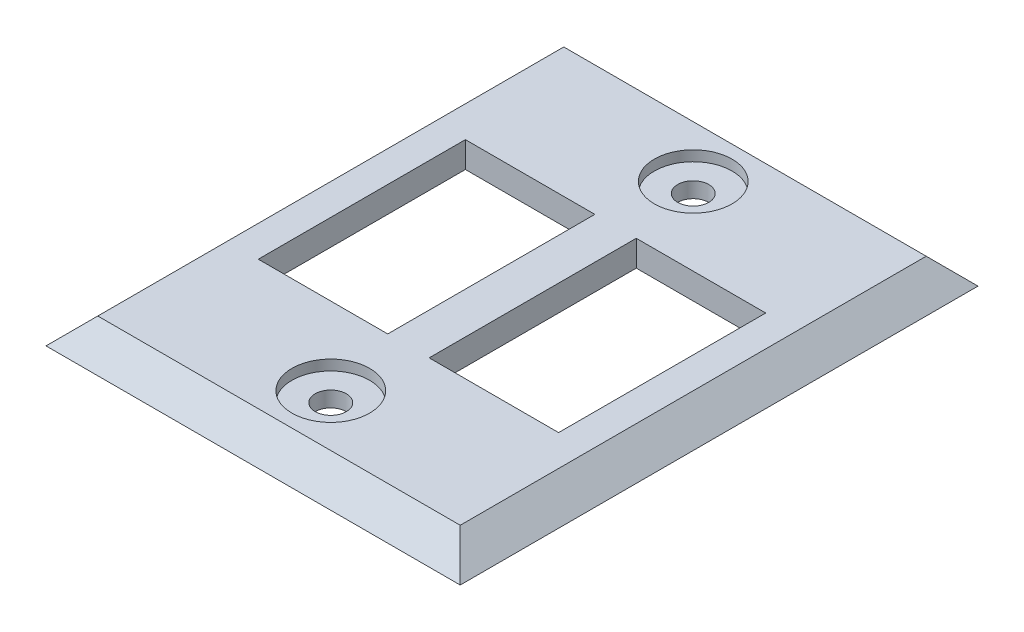
ISO-10303-21;
HEADER;
FILE_DESCRIPTION(('STEP AP214'),'2;1');
FILE_NAME('part.step','',(''),(''),'','','');
FILE_SCHEMA(('AUTOMOTIVE_DESIGN { 1 0 10303 214 1 1 1 1 }'));
ENDSEC;
DATA;
#1=APPLICATION_CONTEXT('core data for automotive mechanical design processes');
#2=APPLICATION_PROTOCOL_DEFINITION('international standard','automotive_design',2000,#1);
#3=PRODUCT_CONTEXT('',#1,'mechanical');
#4=PRODUCT('Part','Part','',(#3));
#5=PRODUCT_RELATED_PRODUCT_CATEGORY('part','',(#4));
#6=PRODUCT_DEFINITION_FORMATION('','',#4);
#7=PRODUCT_DEFINITION_CONTEXT('part definition',#1,'design');
#8=PRODUCT_DEFINITION('design','',#6,#7);
#9=PRODUCT_DEFINITION_SHAPE('','',#8);
#10=(LENGTH_UNIT() NAMED_UNIT(*) SI_UNIT(.MILLI.,.METRE.));
#11=(NAMED_UNIT(*) PLANE_ANGLE_UNIT() SI_UNIT($,.RADIAN.));
#12=(NAMED_UNIT(*) SI_UNIT($,.STERADIAN.) SOLID_ANGLE_UNIT());
#13=UNCERTAINTY_MEASURE_WITH_UNIT(LENGTH_MEASURE(1.E-05),#10,'distance_accuracy_value','');
#14=(GEOMETRIC_REPRESENTATION_CONTEXT(3) GLOBAL_UNCERTAINTY_ASSIGNED_CONTEXT((#13)) GLOBAL_UNIT_ASSIGNED_CONTEXT((#10,
#11,#12)) REPRESENTATION_CONTEXT('',''));
#15=CARTESIAN_POINT('',(0.,0.,0.));
#16=DIRECTION('',(0.,0.,1.));
#17=DIRECTION('',(1.,0.,0.));
#18=AXIS2_PLACEMENT_3D('',#15,#16,#17);
#19=CARTESIAN_POINT('',(0.,-7.5,17.5));
#20=DIRECTION('',(0.,1.,0.));
#21=DIRECTION('',(0.,0.,1.));
#22=AXIS2_PLACEMENT_3D('',#19,#20,#21);
#23=CYLINDRICAL_SURFACE('',#22,1.5);
#24=CARTESIAN_POINT('',(0.,0.,17.5));
#25=DIRECTION('',(0.,1.,0.));
#26=DIRECTION('',(0.,0.,1.));
#27=AXIS2_PLACEMENT_3D('',#24,#25,#26);
#28=CIRCLE('',#27,1.5);
#29=CARTESIAN_POINT('',(0.,0.,19.));
#30=VERTEX_POINT('',#29);
#31=EDGE_CURVE('E216',#30,#30,#28,.T.);
#32=ORIENTED_EDGE('',*,*,#31,.F.);
#33=EDGE_LOOP('',(#32));
#34=FACE_BOUND('',#33,.T.);
#35=CARTESIAN_POINT('',(0.,1.5,17.5));
#36=DIRECTION('',(0.,1.,0.));
#37=DIRECTION('',(0.,0.,1.));
#38=AXIS2_PLACEMENT_3D('',#35,#36,#37);
#39=CIRCLE('',#38,1.5);
#40=CARTESIAN_POINT('',(0.,1.5,19.));
#41=VERTEX_POINT('',#40);
#42=EDGE_CURVE('E223',#41,#41,#39,.F.);
#43=ORIENTED_EDGE('',*,*,#42,.F.);
#44=EDGE_LOOP('',(#43));
#45=FACE_BOUND('',#44,.T.);
#46=ADVANCED_FACE('F35',(#34,#45),#23,.F.);
#47=CARTESIAN_POINT('',(0.,-7.5,-17.5));
#48=DIRECTION('',(0.,1.,0.));
#49=DIRECTION('',(0.,0.,1.));
#50=AXIS2_PLACEMENT_3D('',#47,#48,#49);
#51=CYLINDRICAL_SURFACE('',#50,1.5);
#52=CARTESIAN_POINT('',(0.,0.,-17.5));
#53=DIRECTION('',(0.,1.,0.));
#54=DIRECTION('',(0.,0.,1.));
#55=AXIS2_PLACEMENT_3D('',#52,#53,#54);
#56=CIRCLE('',#55,1.5);
#57=CARTESIAN_POINT('',(0.,0.,-16.));
#58=VERTEX_POINT('',#57);
#59=EDGE_CURVE('E161',#58,#58,#56,.T.);
#60=ORIENTED_EDGE('',*,*,#59,.F.);
#61=EDGE_LOOP('',(#60));
#62=FACE_BOUND('',#61,.T.);
#63=CARTESIAN_POINT('',(0.,1.5,-17.5));
#64=DIRECTION('',(0.,1.,0.));
#65=DIRECTION('',(0.,0.,1.));
#66=AXIS2_PLACEMENT_3D('',#63,#64,#65);
#67=CIRCLE('',#66,1.5);
#68=CARTESIAN_POINT('',(0.,1.5,-16.));
#69=VERTEX_POINT('',#68);
#70=EDGE_CURVE('E219',#69,#69,#67,.F.);
#71=ORIENTED_EDGE('',*,*,#70,.F.);
#72=EDGE_LOOP('',(#71));
#73=FACE_BOUND('',#72,.T.);
#74=ADVANCED_FACE('F258',(#62,#73),#51,.F.);
#75=CARTESIAN_POINT('',(0.,2.5,0.));
#76=DIRECTION('',(0.,1.,0.));
#77=DIRECTION('',(0.,0.,1.));
#78=AXIS2_PLACEMENT_3D('',#75,#76,#77);
#79=PLANE('',#78);
#80=DIRECTION('',(1.,0.,0.));
#81=VECTOR('',#80,1.);
#82=CARTESIAN_POINT('',(20.,2.5,22.5));
#83=LINE('',#82,#81);
#84=CARTESIAN_POINT('',(-17.5,2.5,22.5));
#85=VERTEX_POINT('',#84);
#86=CARTESIAN_POINT('',(17.5,2.5,22.5));
#87=VERTEX_POINT('',#86);
#88=EDGE_CURVE('E44',#85,#87,#83,.T.);
#89=ORIENTED_EDGE('',*,*,#88,.T.);
#90=DIRECTION('',(0.,0.,-1.));
#91=VECTOR('',#90,1.);
#92=CARTESIAN_POINT('',(17.5,2.5,-25.));
#93=LINE('',#92,#91);
#94=CARTESIAN_POINT('',(17.5,2.5,-22.5));
#95=VERTEX_POINT('',#94);
#96=EDGE_CURVE('E11',#87,#95,#93,.T.);
#97=ORIENTED_EDGE('',*,*,#96,.T.);
#98=DIRECTION('',(-1.,0.,0.));
#99=VECTOR('',#98,1.);
#100=CARTESIAN_POINT('',(-20.,2.5,-22.5));
#101=LINE('',#100,#99);
#102=CARTESIAN_POINT('',(-17.5,2.5,-22.5));
#103=VERTEX_POINT('',#102);
#104=EDGE_CURVE('E229',#95,#103,#101,.T.);
#105=ORIENTED_EDGE('',*,*,#104,.T.);
#106=DIRECTION('',(0.,0.,1.));
#107=VECTOR('',#106,1.);
#108=CARTESIAN_POINT('',(-17.5,2.5,25.));
#109=LINE('',#108,#107);
#110=EDGE_CURVE('E213',#103,#85,#109,.T.);
#111=ORIENTED_EDGE('',*,*,#110,.T.);
#112=EDGE_LOOP('',(#89,#97,#105,#111));
#113=FACE_BOUND('',#112,.T.);
#114=CARTESIAN_POINT('',(0.,2.5,17.5));
#115=DIRECTION('',(0.,1.,0.));
#116=DIRECTION('',(0.,0.,1.));
#117=AXIS2_PLACEMENT_3D('',#114,#115,#116);
#118=CIRCLE('',#117,3.75);
#119=CARTESIAN_POINT('',(0.,2.5,21.25));
#120=VERTEX_POINT('',#119);
#121=EDGE_CURVE('E239',#120,#120,#118,.T.);
#122=ORIENTED_EDGE('',*,*,#121,.F.);
#123=EDGE_LOOP('',(#122));
#124=FACE_BOUND('',#123,.T.);
#125=CARTESIAN_POINT('',(0.,2.5,-17.5));
#126=DIRECTION('',(0.,1.,0.));
#127=DIRECTION('',(0.,0.,1.));
#128=AXIS2_PLACEMENT_3D('',#125,#126,#127);
#129=CIRCLE('',#128,3.75);
#130=CARTESIAN_POINT('',(0.,2.5,-13.75));
#131=VERTEX_POINT('',#130);
#132=EDGE_CURVE('E226',#131,#131,#129,.T.);
#133=ORIENTED_EDGE('',*,*,#132,.F.);
#134=EDGE_LOOP('',(#133));
#135=FACE_BOUND('',#134,.T.);
#136=DIRECTION('',(1.,0.,0.));
#137=VECTOR('',#136,1.);
#138=CARTESIAN_POINT('',(-14.5,2.5,10.));
#139=LINE('',#138,#137);
#140=CARTESIAN_POINT('',(-14.5,2.5,10.));
#141=VERTEX_POINT('',#140);
#142=CARTESIAN_POINT('',(-2.,2.5,10.));
#143=VERTEX_POINT('',#142);
#144=EDGE_CURVE('E174',#141,#143,#139,.T.);
#145=ORIENTED_EDGE('',*,*,#144,.F.);
#146=DIRECTION('',(0.,0.,1.));
#147=VECTOR('',#146,1.);
#148=CARTESIAN_POINT('',(-14.5,2.5,-10.));
#149=LINE('',#148,#147);
#150=CARTESIAN_POINT('',(-14.5,2.5,-10.));
#151=VERTEX_POINT('',#150);
#152=EDGE_CURVE('E172',#151,#141,#149,.T.);
#153=ORIENTED_EDGE('',*,*,#152,.F.);
#154=DIRECTION('',(-1.,0.,0.));
#155=VECTOR('',#154,1.);
#156=CARTESIAN_POINT('',(-14.5,2.5,-10.));
#157=LINE('',#156,#155);
#158=CARTESIAN_POINT('',(-2.,2.5,-10.));
#159=VERTEX_POINT('',#158);
#160=EDGE_CURVE('E180',#159,#151,#157,.T.);
#161=ORIENTED_EDGE('',*,*,#160,.F.);
#162=DIRECTION('',(0.,0.,-1.));
#163=VECTOR('',#162,1.);
#164=CARTESIAN_POINT('',(-2.,2.5,-10.));
#165=LINE('',#164,#163);
#166=EDGE_CURVE('E177',#143,#159,#165,.T.);
#167=ORIENTED_EDGE('',*,*,#166,.F.);
#168=EDGE_LOOP('',(#145,#153,#161,#167));
#169=FACE_BOUND('',#168,.T.);
#170=DIRECTION('',(0.,0.,1.));
#171=VECTOR('',#170,1.);
#172=CARTESIAN_POINT('',(2.,2.5,-10.));
#173=LINE('',#172,#171);
#174=CARTESIAN_POINT('',(2.,2.5,-10.));
#175=VERTEX_POINT('',#174);
#176=CARTESIAN_POINT('',(2.,2.5,10.));
#177=VERTEX_POINT('',#176);
#178=EDGE_CURVE('E138',#175,#177,#173,.T.);
#179=ORIENTED_EDGE('',*,*,#178,.F.);
#180=DIRECTION('',(-1.,0.,0.));
#181=VECTOR('',#180,1.);
#182=CARTESIAN_POINT('',(14.5,2.5,-10.));
#183=LINE('',#182,#181);
#184=CARTESIAN_POINT('',(14.5,2.5,-10.));
#185=VERTEX_POINT('',#184);
#186=EDGE_CURVE('E128',#185,#175,#183,.T.);
#187=ORIENTED_EDGE('',*,*,#186,.F.);
#188=DIRECTION('',(0.,0.,-1.));
#189=VECTOR('',#188,1.);
#190=CARTESIAN_POINT('',(14.5,2.5,-10.));
#191=LINE('',#190,#189);
#192=CARTESIAN_POINT('',(14.5,2.5,10.));
#193=VERTEX_POINT('',#192);
#194=EDGE_CURVE('E154',#193,#185,#191,.T.);
#195=ORIENTED_EDGE('',*,*,#194,.F.);
#196=DIRECTION('',(1.,0.,0.));
#197=VECTOR('',#196,1.);
#198=CARTESIAN_POINT('',(14.5,2.5,10.));
#199=LINE('',#198,#197);
#200=EDGE_CURVE('E152',#177,#193,#199,.T.);
#201=ORIENTED_EDGE('',*,*,#200,.F.);
#202=EDGE_LOOP('',(#179,#187,#195,#201));
#203=FACE_BOUND('',#202,.T.);
#204=ADVANCED_FACE('F150',(#113,#124,#135,#169,#203),#79,.T.);
#205=CARTESIAN_POINT('',(0.,0.,0.));
#206=DIRECTION('',(0.,1.,0.));
#207=DIRECTION('',(0.,0.,1.));
#208=AXIS2_PLACEMENT_3D('',#205,#206,#207);
#209=PLANE('',#208);
#210=ORIENTED_EDGE('',*,*,#31,.T.);
#211=EDGE_LOOP('',(#210));
#212=FACE_BOUND('',#211,.T.);
#213=ORIENTED_EDGE('',*,*,#59,.T.);
#214=EDGE_LOOP('',(#213));
#215=FACE_BOUND('',#214,.T.);
#216=DIRECTION('',(0.,0.,1.));
#217=VECTOR('',#216,1.);
#218=CARTESIAN_POINT('',(-14.5,0.,-10.));
#219=LINE('',#218,#217);
#220=CARTESIAN_POINT('',(-14.5,0.,-10.));
#221=VERTEX_POINT('',#220);
#222=CARTESIAN_POINT('',(-14.5,0.,10.));
#223=VERTEX_POINT('',#222);
#224=EDGE_CURVE('E146',#221,#223,#219,.T.);
#225=ORIENTED_EDGE('',*,*,#224,.T.);
#226=DIRECTION('',(1.,0.,0.));
#227=VECTOR('',#226,1.);
#228=CARTESIAN_POINT('',(-14.5,0.,10.));
#229=LINE('',#228,#227);
#230=CARTESIAN_POINT('',(-2.,0.,10.));
#231=VERTEX_POINT('',#230);
#232=EDGE_CURVE('E185',#223,#231,#229,.T.);
#233=ORIENTED_EDGE('',*,*,#232,.T.);
#234=DIRECTION('',(0.,0.,-1.));
#235=VECTOR('',#234,1.);
#236=CARTESIAN_POINT('',(-2.,0.,-10.));
#237=LINE('',#236,#235);
#238=CARTESIAN_POINT('',(-2.,0.,-10.));
#239=VERTEX_POINT('',#238);
#240=EDGE_CURVE('E188',#231,#239,#237,.T.);
#241=ORIENTED_EDGE('',*,*,#240,.T.);
#242=DIRECTION('',(-1.,0.,0.));
#243=VECTOR('',#242,1.);
#244=CARTESIAN_POINT('',(-14.5,0.,-10.));
#245=LINE('',#244,#243);
#246=EDGE_CURVE('E175',#239,#221,#245,.T.);
#247=ORIENTED_EDGE('',*,*,#246,.T.);
#248=EDGE_LOOP('',(#225,#233,#241,#247));
#249=FACE_BOUND('',#248,.T.);
#250=DIRECTION('',(0.,0.,1.));
#251=VECTOR('',#250,1.);
#252=CARTESIAN_POINT('',(-20.,0.,-25.));
#253=LINE('',#252,#251);
#254=CARTESIAN_POINT('',(-20.,0.,-25.));
#255=VERTEX_POINT('',#254);
#256=CARTESIAN_POINT('',(-20.,0.,25.));
#257=VERTEX_POINT('',#256);
#258=EDGE_CURVE('E202',#255,#257,#253,.T.);
#259=ORIENTED_EDGE('',*,*,#258,.F.);
#260=DIRECTION('',(-1.,0.,0.));
#261=VECTOR('',#260,1.);
#262=CARTESIAN_POINT('',(-20.,0.,-25.));
#263=LINE('',#262,#261);
#264=CARTESIAN_POINT('',(20.,0.,-25.));
#265=VERTEX_POINT('',#264);
#266=EDGE_CURVE('E210',#265,#255,#263,.T.);
#267=ORIENTED_EDGE('',*,*,#266,.F.);
#268=DIRECTION('',(0.,0.,-1.));
#269=VECTOR('',#268,1.);
#270=CARTESIAN_POINT('',(20.,0.,-25.));
#271=LINE('',#270,#269);
#272=CARTESIAN_POINT('',(20.,0.,25.));
#273=VERTEX_POINT('',#272);
#274=EDGE_CURVE('E208',#273,#265,#271,.T.);
#275=ORIENTED_EDGE('',*,*,#274,.F.);
#276=DIRECTION('',(1.,0.,0.));
#277=VECTOR('',#276,1.);
#278=CARTESIAN_POINT('',(-20.,0.,25.));
#279=LINE('',#278,#277);
#280=EDGE_CURVE('E205',#257,#273,#279,.T.);
#281=ORIENTED_EDGE('',*,*,#280,.F.);
#282=EDGE_LOOP('',(#259,#267,#275,#281));
#283=FACE_BOUND('',#282,.T.);
#284=DIRECTION('',(-1.,0.,0.));
#285=VECTOR('',#284,1.);
#286=CARTESIAN_POINT('',(14.5,0.,-10.));
#287=LINE('',#286,#285);
#288=CARTESIAN_POINT('',(14.5,0.,-10.));
#289=VERTEX_POINT('',#288);
#290=CARTESIAN_POINT('',(2.,0.,-10.));
#291=VERTEX_POINT('',#290);
#292=EDGE_CURVE('E159',#289,#291,#287,.T.);
#293=ORIENTED_EDGE('',*,*,#292,.T.);
#294=DIRECTION('',(0.,0.,1.));
#295=VECTOR('',#294,1.);
#296=CARTESIAN_POINT('',(2.,0.,-10.));
#297=LINE('',#296,#295);
#298=CARTESIAN_POINT('',(2.,0.,10.));
#299=VERTEX_POINT('',#298);
#300=EDGE_CURVE('E145',#291,#299,#297,.T.);
#301=ORIENTED_EDGE('',*,*,#300,.T.);
#302=DIRECTION('',(1.,0.,0.));
#303=VECTOR('',#302,1.);
#304=CARTESIAN_POINT('',(14.5,0.,10.));
#305=LINE('',#304,#303);
#306=CARTESIAN_POINT('',(14.5,0.,10.));
#307=VERTEX_POINT('',#306);
#308=EDGE_CURVE('E163',#299,#307,#305,.T.);
#309=ORIENTED_EDGE('',*,*,#308,.T.);
#310=DIRECTION('',(0.,0.,-1.));
#311=VECTOR('',#310,1.);
#312=CARTESIAN_POINT('',(14.5,0.,-10.));
#313=LINE('',#312,#311);
#314=EDGE_CURVE('E139',#307,#289,#313,.T.);
#315=ORIENTED_EDGE('',*,*,#314,.T.);
#316=EDGE_LOOP('',(#293,#301,#309,#315));
#317=FACE_BOUND('',#316,.T.);
#318=ADVANCED_FACE('F257',(#212,#215,#249,#283,#317),#209,.F.);
#319=CARTESIAN_POINT('',(-14.5,2.5,-10.));
#320=DIRECTION('',(1.,0.,0.));
#321=DIRECTION('',(0.,0.,-1.));
#322=AXIS2_PLACEMENT_3D('',#319,#320,#321);
#323=PLANE('',#322);
#324=ORIENTED_EDGE('',*,*,#224,.F.);
#325=DIRECTION('',(0.,-1.,0.));
#326=VECTOR('',#325,1.);
#327=CARTESIAN_POINT('',(-14.5,2.5,-10.));
#328=LINE('',#327,#326);
#329=EDGE_CURVE('E182',#151,#221,#328,.T.);
#330=ORIENTED_EDGE('',*,*,#329,.F.);
#331=ORIENTED_EDGE('',*,*,#152,.T.);
#332=DIRECTION('',(0.,-1.,0.));
#333=VECTOR('',#332,1.);
#334=CARTESIAN_POINT('',(-14.5,2.5,10.));
#335=LINE('',#334,#333);
#336=EDGE_CURVE('E199',#141,#223,#335,.T.);
#337=ORIENTED_EDGE('',*,*,#336,.T.);
#338=EDGE_LOOP('',(#324,#330,#331,#337));
#339=FACE_BOUND('',#338,.T.);
#340=ADVANCED_FACE('F275',(#339),#323,.T.);
#341=CARTESIAN_POINT('',(-14.5,2.5,10.));
#342=DIRECTION('',(0.,0.,-1.));
#343=DIRECTION('',(-1.,0.,0.));
#344=AXIS2_PLACEMENT_3D('',#341,#342,#343);
#345=PLANE('',#344);
#346=ORIENTED_EDGE('',*,*,#232,.F.);
#347=ORIENTED_EDGE('',*,*,#336,.F.);
#348=ORIENTED_EDGE('',*,*,#144,.T.);
#349=DIRECTION('',(0.,-1.,0.));
#350=VECTOR('',#349,1.);
#351=CARTESIAN_POINT('',(-2.,2.5,10.));
#352=LINE('',#351,#350);
#353=EDGE_CURVE('E197',#143,#231,#352,.T.);
#354=ORIENTED_EDGE('',*,*,#353,.T.);
#355=EDGE_LOOP('',(#346,#347,#348,#354));
#356=FACE_BOUND('',#355,.T.);
#357=ADVANCED_FACE('F267',(#356),#345,.T.);
#358=CARTESIAN_POINT('',(-2.,2.5,-10.));
#359=DIRECTION('',(-1.,0.,0.));
#360=DIRECTION('',(0.,0.,1.));
#361=AXIS2_PLACEMENT_3D('',#358,#359,#360);
#362=PLANE('',#361);
#363=ORIENTED_EDGE('',*,*,#240,.F.);
#364=ORIENTED_EDGE('',*,*,#353,.F.);
#365=ORIENTED_EDGE('',*,*,#166,.T.);
#366=DIRECTION('',(0.,-1.,0.));
#367=VECTOR('',#366,1.);
#368=CARTESIAN_POINT('',(-2.,2.5,-10.));
#369=LINE('',#368,#367);
#370=EDGE_CURVE('E195',#159,#239,#369,.T.);
#371=ORIENTED_EDGE('',*,*,#370,.T.);
#372=EDGE_LOOP('',(#363,#364,#365,#371));
#373=FACE_BOUND('',#372,.T.);
#374=ADVANCED_FACE('F270',(#373),#362,.T.);
#375=CARTESIAN_POINT('',(-14.5,2.5,-10.));
#376=DIRECTION('',(0.,0.,1.));
#377=DIRECTION('',(1.,0.,0.));
#378=AXIS2_PLACEMENT_3D('',#375,#376,#377);
#379=PLANE('',#378);
#380=ORIENTED_EDGE('',*,*,#246,.F.);
#381=ORIENTED_EDGE('',*,*,#370,.F.);
#382=ORIENTED_EDGE('',*,*,#160,.T.);
#383=ORIENTED_EDGE('',*,*,#329,.T.);
#384=EDGE_LOOP('',(#380,#381,#382,#383));
#385=FACE_BOUND('',#384,.T.);
#386=ADVANCED_FACE('F278',(#385),#379,.T.);
#387=CARTESIAN_POINT('',(14.5,2.5,-10.));
#388=DIRECTION('',(0.,0.,1.));
#389=DIRECTION('',(1.,0.,0.));
#390=AXIS2_PLACEMENT_3D('',#387,#388,#389);
#391=PLANE('',#390);
#392=ORIENTED_EDGE('',*,*,#292,.F.);
#393=DIRECTION('',(0.,-1.,0.));
#394=VECTOR('',#393,1.);
#395=CARTESIAN_POINT('',(14.5,2.5,-10.));
#396=LINE('',#395,#394);
#397=EDGE_CURVE('E134',#185,#289,#396,.T.);
#398=ORIENTED_EDGE('',*,*,#397,.F.);
#399=ORIENTED_EDGE('',*,*,#186,.T.);
#400=DIRECTION('',(0.,-1.,0.));
#401=VECTOR('',#400,1.);
#402=CARTESIAN_POINT('',(2.,2.5,-10.));
#403=LINE('',#402,#401);
#404=EDGE_CURVE('E131',#175,#291,#403,.T.);
#405=ORIENTED_EDGE('',*,*,#404,.T.);
#406=EDGE_LOOP('',(#392,#398,#399,#405));
#407=FACE_BOUND('',#406,.T.);
#408=ADVANCED_FACE('F130',(#407),#391,.T.);
#409=CARTESIAN_POINT('',(2.,2.5,-10.));
#410=DIRECTION('',(1.,0.,0.));
#411=DIRECTION('',(0.,0.,-1.));
#412=AXIS2_PLACEMENT_3D('',#409,#410,#411);
#413=PLANE('',#412);
#414=ORIENTED_EDGE('',*,*,#300,.F.);
#415=ORIENTED_EDGE('',*,*,#404,.F.);
#416=ORIENTED_EDGE('',*,*,#178,.T.);
#417=DIRECTION('',(0.,-1.,0.));
#418=VECTOR('',#417,1.);
#419=CARTESIAN_POINT('',(2.,2.5,10.));
#420=LINE('',#419,#418);
#421=EDGE_CURVE('E147',#177,#299,#420,.T.);
#422=ORIENTED_EDGE('',*,*,#421,.T.);
#423=EDGE_LOOP('',(#414,#415,#416,#422));
#424=FACE_BOUND('',#423,.T.);
#425=ADVANCED_FACE('F142',(#424),#413,.T.);
#426=CARTESIAN_POINT('',(14.5,2.5,10.));
#427=DIRECTION('',(0.,0.,-1.));
#428=DIRECTION('',(-1.,0.,0.));
#429=AXIS2_PLACEMENT_3D('',#426,#427,#428);
#430=PLANE('',#429);
#431=ORIENTED_EDGE('',*,*,#308,.F.);
#432=ORIENTED_EDGE('',*,*,#421,.F.);
#433=ORIENTED_EDGE('',*,*,#200,.T.);
#434=DIRECTION('',(0.,-1.,0.));
#435=VECTOR('',#434,1.);
#436=CARTESIAN_POINT('',(14.5,2.5,10.));
#437=LINE('',#436,#435);
#438=EDGE_CURVE('E169',#193,#307,#437,.T.);
#439=ORIENTED_EDGE('',*,*,#438,.T.);
#440=EDGE_LOOP('',(#431,#432,#433,#439));
#441=FACE_BOUND('',#440,.T.);
#442=ADVANCED_FACE('F304',(#441),#430,.T.);
#443=CARTESIAN_POINT('',(14.5,2.5,-10.));
#444=DIRECTION('',(-1.,0.,0.));
#445=DIRECTION('',(0.,0.,1.));
#446=AXIS2_PLACEMENT_3D('',#443,#444,#445);
#447=PLANE('',#446);
#448=ORIENTED_EDGE('',*,*,#314,.F.);
#449=ORIENTED_EDGE('',*,*,#438,.F.);
#450=ORIENTED_EDGE('',*,*,#194,.T.);
#451=ORIENTED_EDGE('',*,*,#397,.T.);
#452=EDGE_LOOP('',(#448,#449,#450,#451));
#453=FACE_BOUND('',#452,.T.);
#454=ADVANCED_FACE('F300',(#453),#447,.T.);
#455=CARTESIAN_POINT('',(0.,1.5,-17.5));
#456=DIRECTION('',(0.,1.,0.));
#457=DIRECTION('',(0.,0.,1.));
#458=AXIS2_PLACEMENT_3D('',#455,#456,#457);
#459=PLANE('',#458);
#460=CARTESIAN_POINT('',(0.,1.5,-17.5));
#461=DIRECTION('',(0.,1.,0.));
#462=DIRECTION('',(0.,0.,1.));
#463=AXIS2_PLACEMENT_3D('',#460,#461,#462);
#464=CIRCLE('',#463,3.75);
#465=CARTESIAN_POINT('',(0.,1.5,-13.75));
#466=VERTEX_POINT('',#465);
#467=EDGE_CURVE('E222',#466,#466,#464,.T.);
#468=ORIENTED_EDGE('',*,*,#467,.T.);
#469=EDGE_LOOP('',(#468));
#470=FACE_BOUND('',#469,.T.);
#471=ORIENTED_EDGE('',*,*,#70,.T.);
#472=EDGE_LOOP('',(#471));
#473=FACE_BOUND('',#472,.T.);
#474=ADVANCED_FACE('F303',(#470,#473),#459,.T.);
#475=CARTESIAN_POINT('',(0.,1.5,-17.5));
#476=DIRECTION('',(0.,1.,0.));
#477=DIRECTION('',(0.,0.,1.));
#478=AXIS2_PLACEMENT_3D('',#475,#476,#477);
#479=CYLINDRICAL_SURFACE('',#478,3.75);
#480=ORIENTED_EDGE('',*,*,#467,.F.);
#481=EDGE_LOOP('',(#480));
#482=FACE_BOUND('',#481,.T.);
#483=ORIENTED_EDGE('',*,*,#132,.T.);
#484=EDGE_LOOP('',(#483));
#485=FACE_BOUND('',#484,.T.);
#486=ADVANCED_FACE('F253',(#482,#485),#479,.F.);
#487=CARTESIAN_POINT('',(0.,1.5,17.5));
#488=DIRECTION('',(0.,1.,0.));
#489=DIRECTION('',(0.,0.,1.));
#490=AXIS2_PLACEMENT_3D('',#487,#488,#489);
#491=PLANE('',#490);
#492=CARTESIAN_POINT('',(0.,1.5,17.5));
#493=DIRECTION('',(0.,1.,0.));
#494=DIRECTION('',(0.,0.,1.));
#495=AXIS2_PLACEMENT_3D('',#492,#493,#494);
#496=CIRCLE('',#495,3.75);
#497=CARTESIAN_POINT('',(0.,1.5,21.25));
#498=VERTEX_POINT('',#497);
#499=EDGE_CURVE('E227',#498,#498,#496,.T.);
#500=ORIENTED_EDGE('',*,*,#499,.T.);
#501=EDGE_LOOP('',(#500));
#502=FACE_BOUND('',#501,.T.);
#503=ORIENTED_EDGE('',*,*,#42,.T.);
#504=EDGE_LOOP('',(#503));
#505=FACE_BOUND('',#504,.T.);
#506=ADVANCED_FACE('F335',(#502,#505),#491,.T.);
#507=CARTESIAN_POINT('',(0.,1.5,17.5));
#508=DIRECTION('',(0.,1.,0.));
#509=DIRECTION('',(0.,0.,1.));
#510=AXIS2_PLACEMENT_3D('',#507,#508,#509);
#511=CYLINDRICAL_SURFACE('',#510,3.75);
#512=ORIENTED_EDGE('',*,*,#499,.F.);
#513=EDGE_LOOP('',(#512));
#514=FACE_BOUND('',#513,.T.);
#515=ORIENTED_EDGE('',*,*,#121,.T.);
#516=EDGE_LOOP('',(#515));
#517=FACE_BOUND('',#516,.T.);
#518=ADVANCED_FACE('F342',(#514,#517),#511,.F.);
#519=CARTESIAN_POINT('',(-17.5,2.5,0.));
#520=DIRECTION('',(-0.70710678118655,0.707106781186545,0.));
#521=DIRECTION('',(0.,0.,-1.));
#522=AXIS2_PLACEMENT_3D('',#519,#520,#521);
#523=PLANE('',#522);
#524=DIRECTION('',(-0.577350269189624,-0.577350269189628,-0.577350269189625));
#525=VECTOR('',#524,1.);
#526=CARTESIAN_POINT('',(-10.,10.,-15.));
#527=LINE('',#526,#525);
#528=EDGE_CURVE('E234',#255,#103,#527,.F.);
#529=ORIENTED_EDGE('',*,*,#528,.F.);
#530=ORIENTED_EDGE('',*,*,#258,.T.);
#531=DIRECTION('',(0.577350269189624,0.577350269189628,-0.577350269189625));
#532=VECTOR('',#531,1.);
#533=CARTESIAN_POINT('',(-10.,10.,15.));
#534=LINE('',#533,#532);
#535=EDGE_CURVE('E39',#85,#257,#534,.F.);
#536=ORIENTED_EDGE('',*,*,#535,.F.);
#537=ORIENTED_EDGE('',*,*,#110,.F.);
#538=EDGE_LOOP('',(#529,#530,#536,#537));
#539=FACE_BOUND('',#538,.T.);
#540=ADVANCED_FACE('F37',(#539),#523,.T.);
#541=CARTESIAN_POINT('',(0.,2.5,22.5));
#542=DIRECTION('',(0.,0.707106781186546,0.707106781186549));
#543=DIRECTION('',(-1.,0.,0.));
#544=AXIS2_PLACEMENT_3D('',#541,#542,#543);
#545=PLANE('',#544);
#546=ORIENTED_EDGE('',*,*,#535,.T.);
#547=ORIENTED_EDGE('',*,*,#280,.T.);
#548=DIRECTION('',(-0.577350269189625,0.577350269189628,-0.577350269189625));
#549=VECTOR('',#548,1.);
#550=CARTESIAN_POINT('',(11.6666666666667,8.33333333333334,16.6666666666667));
#551=LINE('',#550,#549);
#552=EDGE_CURVE('E233',#87,#273,#551,.F.);
#553=ORIENTED_EDGE('',*,*,#552,.F.);
#554=ORIENTED_EDGE('',*,*,#88,.F.);
#555=EDGE_LOOP('',(#546,#547,#553,#554));
#556=FACE_BOUND('',#555,.T.);
#557=ADVANCED_FACE('F358',(#556),#545,.T.);
#558=CARTESIAN_POINT('',(0.,2.5,-22.5));
#559=DIRECTION('',(0.,0.707106781186546,-0.707106781186549));
#560=DIRECTION('',(1.,0.,0.));
#561=AXIS2_PLACEMENT_3D('',#558,#559,#560);
#562=PLANE('',#561);
#563=ORIENTED_EDGE('',*,*,#528,.T.);
#564=ORIENTED_EDGE('',*,*,#104,.F.);
#565=DIRECTION('',(0.577350269189625,-0.577350269189628,-0.577350269189625));
#566=VECTOR('',#565,1.);
#567=CARTESIAN_POINT('',(11.6666666666667,8.33333333333334,-16.6666666666667));
#568=LINE('',#567,#566);
#569=EDGE_CURVE('E58',#265,#95,#568,.F.);
#570=ORIENTED_EDGE('',*,*,#569,.F.);
#571=ORIENTED_EDGE('',*,*,#266,.T.);
#572=EDGE_LOOP('',(#563,#564,#570,#571));
#573=FACE_BOUND('',#572,.T.);
#574=ADVANCED_FACE('F366',(#573),#562,.T.);
#575=CARTESIAN_POINT('',(17.5,2.5,0.));
#576=DIRECTION('',(0.707106781186549,0.707106781186545,0.));
#577=DIRECTION('',(0.,0.,1.));
#578=AXIS2_PLACEMENT_3D('',#575,#576,#577);
#579=PLANE('',#578);
#580=ORIENTED_EDGE('',*,*,#552,.T.);
#581=ORIENTED_EDGE('',*,*,#274,.T.);
#582=ORIENTED_EDGE('',*,*,#569,.T.);
#583=ORIENTED_EDGE('',*,*,#96,.F.);
#584=EDGE_LOOP('',(#580,#581,#582,#583));
#585=FACE_BOUND('',#584,.T.);
#586=ADVANCED_FACE('F372',(#585),#579,.T.);
#587=CLOSED_SHELL('',(#46,#74,#204,#318,#340,#357,#374,#386,#408,#425,#442,#454,#474,#486,#506,
#518,#540,#557,#574,#586));
#588=MANIFOLD_SOLID_BREP('B2',#587);
#589=ADVANCED_BREP_SHAPE_REPRESENTATION('',(#18,#588),#14);
#590=SHAPE_DEFINITION_REPRESENTATION(#9,#589);
ENDSEC;
END-ISO-10303-21;
